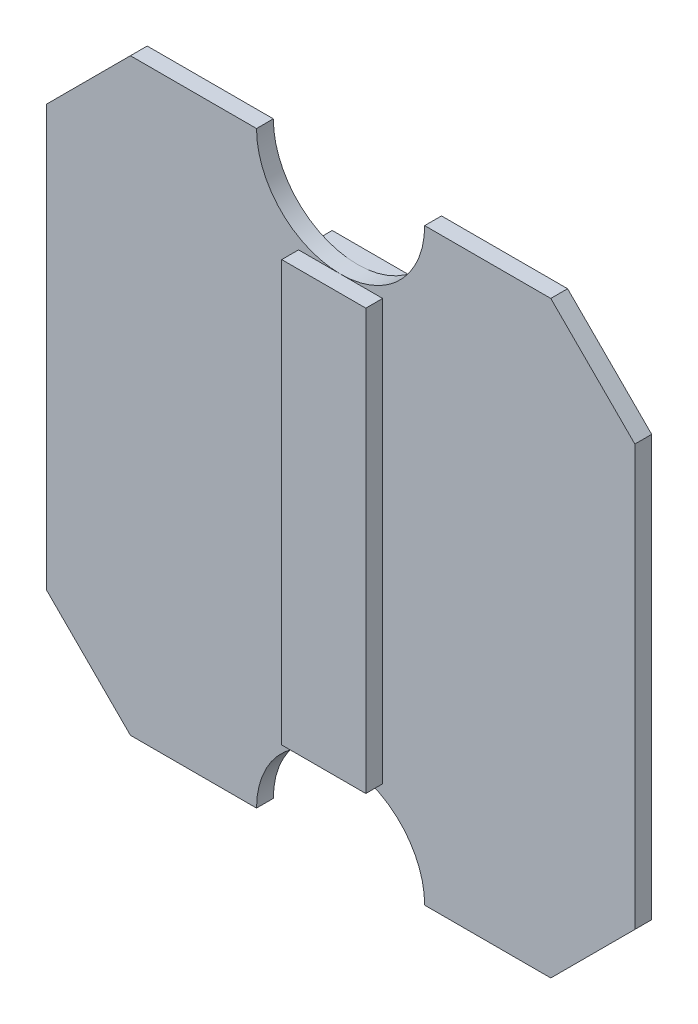
ISO-10303-21;
HEADER;
FILE_DESCRIPTION(('STEP AP214'),'2;1');
FILE_NAME('part.step','',(''),(''),'','','');
FILE_SCHEMA(('AUTOMOTIVE_DESIGN { 1 0 10303 214 1 1 1 1 }'));
ENDSEC;
DATA;
#1=APPLICATION_CONTEXT('core data for automotive mechanical design processes');
#2=APPLICATION_PROTOCOL_DEFINITION('international standard','automotive_design',2000,#1);
#3=PRODUCT_CONTEXT('',#1,'mechanical');
#4=PRODUCT('Part','Part','',(#3));
#5=PRODUCT_RELATED_PRODUCT_CATEGORY('part','',(#4));
#6=PRODUCT_DEFINITION_FORMATION('','',#4);
#7=PRODUCT_DEFINITION_CONTEXT('part definition',#1,'design');
#8=PRODUCT_DEFINITION('design','',#6,#7);
#9=PRODUCT_DEFINITION_SHAPE('','',#8);
#10=(LENGTH_UNIT() NAMED_UNIT(*) SI_UNIT(.MILLI.,.METRE.));
#11=(NAMED_UNIT(*) PLANE_ANGLE_UNIT() SI_UNIT($,.RADIAN.));
#12=(NAMED_UNIT(*) SI_UNIT($,.STERADIAN.) SOLID_ANGLE_UNIT());
#13=UNCERTAINTY_MEASURE_WITH_UNIT(LENGTH_MEASURE(1.E-05),#10,'distance_accuracy_value','');
#14=(GEOMETRIC_REPRESENTATION_CONTEXT(3) GLOBAL_UNCERTAINTY_ASSIGNED_CONTEXT((#13)) GLOBAL_UNIT_ASSIGNED_CONTEXT((#10,
#11,#12)) REPRESENTATION_CONTEXT('',''));
#15=CARTESIAN_POINT('',(0.,0.,0.));
#16=DIRECTION('',(0.,0.,1.));
#17=DIRECTION('',(1.,0.,0.));
#18=AXIS2_PLACEMENT_3D('',#15,#16,#17);
#19=CARTESIAN_POINT('',(0.,175.,10.));
#20=DIRECTION('',(0.,0.,1.));
#21=DIRECTION('',(1.,0.,0.));
#22=AXIS2_PLACEMENT_3D('',#19,#20,#21);
#23=PLANE('',#22);
#24=DIRECTION('',(1.,0.,0.));
#25=VECTOR('',#24,1.);
#26=CARTESIAN_POINT('',(0.,-125.,10.));
#27=LINE('',#26,#25);
#28=CARTESIAN_POINT('',(0.,-125.,10.));
#29=VERTEX_POINT('',#28);
#30=CARTESIAN_POINT('',(25.,-125.,10.));
#31=VERTEX_POINT('',#30);
#32=EDGE_CURVE('E236',#29,#31,#27,.T.);
#33=ORIENTED_EDGE('',*,*,#32,.F.);
#34=CARTESIAN_POINT('',(0.,-175.,10.));
#35=DIRECTION('',(0.,0.,-1.));
#36=DIRECTION('',(1.,0.,0.));
#37=AXIS2_PLACEMENT_3D('',#34,#35,#36);
#38=CIRCLE('',#37,50.);
#39=CARTESIAN_POINT('',(50.,-175.,10.));
#40=VERTEX_POINT('',#39);
#41=EDGE_CURVE('E255',#29,#40,#38,.T.);
#42=ORIENTED_EDGE('',*,*,#41,.T.);
#43=DIRECTION('',(1.,0.,0.));
#44=VECTOR('',#43,1.);
#45=CARTESIAN_POINT('',(50.,-175.,10.));
#46=LINE('',#45,#44);
#47=CARTESIAN_POINT('',(125.,-175.,10.));
#48=VERTEX_POINT('',#47);
#49=EDGE_CURVE('E259',#40,#48,#46,.T.);
#50=ORIENTED_EDGE('',*,*,#49,.T.);
#51=DIRECTION('',(0.707106781186547,0.707106781186548,0.));
#52=VECTOR('',#51,1.);
#53=CARTESIAN_POINT('',(125.,-175.,10.));
#54=LINE('',#53,#52);
#55=CARTESIAN_POINT('',(175.,-125.,10.));
#56=VERTEX_POINT('',#55);
#57=EDGE_CURVE('E261',#48,#56,#54,.T.);
#58=ORIENTED_EDGE('',*,*,#57,.T.);
#59=DIRECTION('',(0.,1.,0.));
#60=VECTOR('',#59,1.);
#61=CARTESIAN_POINT('',(175.,125.,10.));
#62=LINE('',#61,#60);
#63=CARTESIAN_POINT('',(175.,125.,10.));
#64=VERTEX_POINT('',#63);
#65=EDGE_CURVE('E263',#56,#64,#62,.T.);
#66=ORIENTED_EDGE('',*,*,#65,.T.);
#67=DIRECTION('',(-0.707106781186547,0.707106781186548,0.));
#68=VECTOR('',#67,1.);
#69=CARTESIAN_POINT('',(125.,175.,10.));
#70=LINE('',#69,#68);
#71=CARTESIAN_POINT('',(125.,175.,10.));
#72=VERTEX_POINT('',#71);
#73=EDGE_CURVE('E265',#64,#72,#70,.T.);
#74=ORIENTED_EDGE('',*,*,#73,.T.);
#75=DIRECTION('',(-1.,0.,0.));
#76=VECTOR('',#75,1.);
#77=CARTESIAN_POINT('',(50.,175.,10.));
#78=LINE('',#77,#76);
#79=CARTESIAN_POINT('',(50.,175.,10.));
#80=VERTEX_POINT('',#79);
#81=EDGE_CURVE('E267',#72,#80,#78,.T.);
#82=ORIENTED_EDGE('',*,*,#81,.T.);
#83=CARTESIAN_POINT('',(0.,175.,10.));
#84=DIRECTION('',(0.,0.,-1.));
#85=DIRECTION('',(1.,0.,0.));
#86=AXIS2_PLACEMENT_3D('',#83,#84,#85);
#87=CIRCLE('',#86,50.);
#88=CARTESIAN_POINT('',(0.,125.,10.));
#89=VERTEX_POINT('',#88);
#90=EDGE_CURVE('E241',#80,#89,#87,.T.);
#91=ORIENTED_EDGE('',*,*,#90,.T.);
#92=DIRECTION('',(1.,0.,0.));
#93=VECTOR('',#92,1.);
#94=CARTESIAN_POINT('',(0.,125.,10.));
#95=LINE('',#94,#93);
#96=CARTESIAN_POINT('',(25.,125.,10.));
#97=VERTEX_POINT('',#96);
#98=EDGE_CURVE('E221',#89,#97,#95,.T.);
#99=ORIENTED_EDGE('',*,*,#98,.T.);
#100=DIRECTION('',(0.,-1.,0.));
#101=VECTOR('',#100,1.);
#102=CARTESIAN_POINT('',(25.,175.,10.));
#103=LINE('',#102,#101);
#104=EDGE_CURVE('E187',#97,#31,#103,.T.);
#105=ORIENTED_EDGE('',*,*,#104,.T.);
#106=EDGE_LOOP('',(#33,#42,#50,#58,#66,#74,#82,#91,#99,#105));
#107=FACE_BOUND('',#106,.T.);
#108=ADVANCED_FACE('F34',(#107),#23,.T.);
#109=CARTESIAN_POINT('',(0.,175.,0.));
#110=DIRECTION('',(0.,0.,1.));
#111=DIRECTION('',(1.,0.,0.));
#112=AXIS2_PLACEMENT_3D('',#109,#110,#111);
#113=PLANE('',#112);
#114=CARTESIAN_POINT('',(0.,-175.,0.));
#115=DIRECTION('',(0.,0.,-1.));
#116=DIRECTION('',(1.,0.,0.));
#117=AXIS2_PLACEMENT_3D('',#114,#115,#116);
#118=CIRCLE('',#117,50.);
#119=CARTESIAN_POINT('',(0.,-125.,0.));
#120=VERTEX_POINT('',#119);
#121=CARTESIAN_POINT('',(50.,-175.,0.));
#122=VERTEX_POINT('',#121);
#123=EDGE_CURVE('E283',#120,#122,#118,.T.);
#124=ORIENTED_EDGE('',*,*,#123,.F.);
#125=DIRECTION('',(1.,0.,0.));
#126=VECTOR('',#125,1.);
#127=CARTESIAN_POINT('',(0.,-125.,0.));
#128=LINE('',#127,#126);
#129=CARTESIAN_POINT('',(25.,-125.,0.));
#130=VERTEX_POINT('',#129);
#131=EDGE_CURVE('E11',#120,#130,#128,.T.);
#132=ORIENTED_EDGE('',*,*,#131,.T.);
#133=DIRECTION('',(0.,-1.,0.));
#134=VECTOR('',#133,1.);
#135=CARTESIAN_POINT('',(25.,175.,0.));
#136=LINE('',#135,#134);
#137=CARTESIAN_POINT('',(25.,125.,0.));
#138=VERTEX_POINT('',#137);
#139=EDGE_CURVE('E38',#138,#130,#136,.T.);
#140=ORIENTED_EDGE('',*,*,#139,.F.);
#141=DIRECTION('',(1.,0.,0.));
#142=VECTOR('',#141,1.);
#143=CARTESIAN_POINT('',(0.,125.,0.));
#144=LINE('',#143,#142);
#145=CARTESIAN_POINT('',(0.,125.,0.));
#146=VERTEX_POINT('',#145);
#147=EDGE_CURVE('E332',#146,#138,#144,.T.);
#148=ORIENTED_EDGE('',*,*,#147,.F.);
#149=CARTESIAN_POINT('',(0.,175.,0.));
#150=DIRECTION('',(0.,0.,-1.));
#151=DIRECTION('',(1.,0.,0.));
#152=AXIS2_PLACEMENT_3D('',#149,#150,#151);
#153=CIRCLE('',#152,50.);
#154=CARTESIAN_POINT('',(50.,175.,0.));
#155=VERTEX_POINT('',#154);
#156=EDGE_CURVE('E270',#155,#146,#153,.T.);
#157=ORIENTED_EDGE('',*,*,#156,.F.);
#158=DIRECTION('',(-1.,0.,0.));
#159=VECTOR('',#158,1.);
#160=CARTESIAN_POINT('',(50.,175.,0.));
#161=LINE('',#160,#159);
#162=CARTESIAN_POINT('',(125.,175.,0.));
#163=VERTEX_POINT('',#162);
#164=EDGE_CURVE('E295',#163,#155,#161,.T.);
#165=ORIENTED_EDGE('',*,*,#164,.F.);
#166=DIRECTION('',(-0.707106781186547,0.707106781186548,0.));
#167=VECTOR('',#166,1.);
#168=CARTESIAN_POINT('',(125.,175.,0.));
#169=LINE('',#168,#167);
#170=CARTESIAN_POINT('',(175.,125.,0.));
#171=VERTEX_POINT('',#170);
#172=EDGE_CURVE('E293',#171,#163,#169,.T.);
#173=ORIENTED_EDGE('',*,*,#172,.F.);
#174=DIRECTION('',(0.,1.,0.));
#175=VECTOR('',#174,1.);
#176=CARTESIAN_POINT('',(175.,125.,0.));
#177=LINE('',#176,#175);
#178=CARTESIAN_POINT('',(175.,-125.,0.));
#179=VERTEX_POINT('',#178);
#180=EDGE_CURVE('E291',#179,#171,#177,.T.);
#181=ORIENTED_EDGE('',*,*,#180,.F.);
#182=DIRECTION('',(0.707106781186547,0.707106781186548,0.));
#183=VECTOR('',#182,1.);
#184=CARTESIAN_POINT('',(125.,-175.,0.));
#185=LINE('',#184,#183);
#186=CARTESIAN_POINT('',(125.,-175.,0.));
#187=VERTEX_POINT('',#186);
#188=EDGE_CURVE('E289',#187,#179,#185,.T.);
#189=ORIENTED_EDGE('',*,*,#188,.F.);
#190=DIRECTION('',(1.,0.,0.));
#191=VECTOR('',#190,1.);
#192=CARTESIAN_POINT('',(50.,-175.,0.));
#193=LINE('',#192,#191);
#194=EDGE_CURVE('E287',#122,#187,#193,.T.);
#195=ORIENTED_EDGE('',*,*,#194,.F.);
#196=EDGE_LOOP('',(#124,#132,#140,#148,#157,#165,#173,#181,#189,#195));
#197=FACE_BOUND('',#196,.T.);
#198=ADVANCED_FACE('F359',(#197),#113,.F.);
#199=CARTESIAN_POINT('',(0.,175.,10.));
#200=DIRECTION('',(0.,0.,-1.));
#201=DIRECTION('',(-1.,0.,0.));
#202=AXIS2_PLACEMENT_3D('',#199,#200,#201);
#203=CYLINDRICAL_SURFACE('',#202,50.);
#204=ORIENTED_EDGE('',*,*,#156,.T.);
#205=CARTESIAN_POINT('',(-50.,175.,0.));
#206=VERTEX_POINT('',#205);
#207=EDGE_CURVE('E240',#146,#206,#153,.T.);
#208=ORIENTED_EDGE('',*,*,#207,.T.);
#209=DIRECTION('',(0.,0.,-1.));
#210=VECTOR('',#209,1.);
#211=CARTESIAN_POINT('',(-50.,175.,10.));
#212=LINE('',#211,#210);
#213=CARTESIAN_POINT('',(-50.,175.,10.));
#214=VERTEX_POINT('',#213);
#215=EDGE_CURVE('E329',#214,#206,#212,.T.);
#216=ORIENTED_EDGE('',*,*,#215,.F.);
#217=EDGE_CURVE('E245',#89,#214,#87,.T.);
#218=ORIENTED_EDGE('',*,*,#217,.F.);
#219=ORIENTED_EDGE('',*,*,#90,.F.);
#220=DIRECTION('',(0.,0.,-1.));
#221=VECTOR('',#220,1.);
#222=CARTESIAN_POINT('',(50.,175.,10.));
#223=LINE('',#222,#221);
#224=EDGE_CURVE('E269',#80,#155,#223,.T.);
#225=ORIENTED_EDGE('',*,*,#224,.T.);
#226=EDGE_LOOP('',(#204,#208,#216,#218,#219,#225));
#227=FACE_BOUND('',#226,.T.);
#228=ADVANCED_FACE('F36',(#227),#203,.F.);
#229=CARTESIAN_POINT('',(-125.,175.,10.));
#230=DIRECTION('',(0.,-1.,0.));
#231=DIRECTION('',(0.,0.,-1.));
#232=AXIS2_PLACEMENT_3D('',#229,#230,#231);
#233=PLANE('',#232);
#234=DIRECTION('',(-1.,0.,0.));
#235=VECTOR('',#234,1.);
#236=CARTESIAN_POINT('',(-125.,175.,0.));
#237=LINE('',#236,#235);
#238=CARTESIAN_POINT('',(-125.,175.,0.));
#239=VERTEX_POINT('',#238);
#240=EDGE_CURVE('E273',#206,#239,#237,.T.);
#241=ORIENTED_EDGE('',*,*,#240,.T.);
#242=DIRECTION('',(0.,0.,-1.));
#243=VECTOR('',#242,1.);
#244=CARTESIAN_POINT('',(-125.,175.,10.));
#245=LINE('',#244,#243);
#246=CARTESIAN_POINT('',(-125.,175.,10.));
#247=VERTEX_POINT('',#246);
#248=EDGE_CURVE('E326',#247,#239,#245,.T.);
#249=ORIENTED_EDGE('',*,*,#248,.F.);
#250=DIRECTION('',(-1.,0.,0.));
#251=VECTOR('',#250,1.);
#252=CARTESIAN_POINT('',(-125.,175.,10.));
#253=LINE('',#252,#251);
#254=EDGE_CURVE('E244',#214,#247,#253,.T.);
#255=ORIENTED_EDGE('',*,*,#254,.F.);
#256=ORIENTED_EDGE('',*,*,#215,.T.);
#257=EDGE_LOOP('',(#241,#249,#255,#256));
#258=FACE_BOUND('',#257,.T.);
#259=ADVANCED_FACE('F419',(#258),#233,.F.);
#260=CARTESIAN_POINT('',(-125.,175.,10.));
#261=DIRECTION('',(0.707106781186548,-0.707106781186547,0.));
#262=DIRECTION('',(0.707106781186547,0.707106781186548,0.));
#263=AXIS2_PLACEMENT_3D('',#260,#261,#262);
#264=PLANE('',#263);
#265=DIRECTION('',(-0.707106781186547,-0.707106781186548,0.));
#266=VECTOR('',#265,1.);
#267=CARTESIAN_POINT('',(-125.,175.,0.));
#268=LINE('',#267,#266);
#269=CARTESIAN_POINT('',(-175.,125.,0.));
#270=VERTEX_POINT('',#269);
#271=EDGE_CURVE('E275',#239,#270,#268,.T.);
#272=ORIENTED_EDGE('',*,*,#271,.T.);
#273=DIRECTION('',(0.,0.,-1.));
#274=VECTOR('',#273,1.);
#275=CARTESIAN_POINT('',(-175.,125.,10.));
#276=LINE('',#275,#274);
#277=CARTESIAN_POINT('',(-175.,125.,10.));
#278=VERTEX_POINT('',#277);
#279=EDGE_CURVE('E323',#278,#270,#276,.T.);
#280=ORIENTED_EDGE('',*,*,#279,.F.);
#281=DIRECTION('',(-0.707106781186547,-0.707106781186548,0.));
#282=VECTOR('',#281,1.);
#283=CARTESIAN_POINT('',(-125.,175.,10.));
#284=LINE('',#283,#282);
#285=EDGE_CURVE('E247',#247,#278,#284,.T.);
#286=ORIENTED_EDGE('',*,*,#285,.F.);
#287=ORIENTED_EDGE('',*,*,#248,.T.);
#288=EDGE_LOOP('',(#272,#280,#286,#287));
#289=FACE_BOUND('',#288,.T.);
#290=ADVANCED_FACE('F414',(#289),#264,.F.);
#291=CARTESIAN_POINT('',(-175.,125.,10.));
#292=DIRECTION('',(1.,0.,0.));
#293=DIRECTION('',(0.,0.,-1.));
#294=AXIS2_PLACEMENT_3D('',#291,#292,#293);
#295=PLANE('',#294);
#296=DIRECTION('',(0.,-1.,0.));
#297=VECTOR('',#296,1.);
#298=CARTESIAN_POINT('',(-175.,125.,0.));
#299=LINE('',#298,#297);
#300=CARTESIAN_POINT('',(-175.,-125.,0.));
#301=VERTEX_POINT('',#300);
#302=EDGE_CURVE('E277',#270,#301,#299,.T.);
#303=ORIENTED_EDGE('',*,*,#302,.T.);
#304=DIRECTION('',(0.,0.,-1.));
#305=VECTOR('',#304,1.);
#306=CARTESIAN_POINT('',(-175.,-125.,10.));
#307=LINE('',#306,#305);
#308=CARTESIAN_POINT('',(-175.,-125.,10.));
#309=VERTEX_POINT('',#308);
#310=EDGE_CURVE('E320',#309,#301,#307,.T.);
#311=ORIENTED_EDGE('',*,*,#310,.F.);
#312=DIRECTION('',(0.,-1.,0.));
#313=VECTOR('',#312,1.);
#314=CARTESIAN_POINT('',(-175.,125.,10.));
#315=LINE('',#314,#313);
#316=EDGE_CURVE('E249',#278,#309,#315,.T.);
#317=ORIENTED_EDGE('',*,*,#316,.F.);
#318=ORIENTED_EDGE('',*,*,#279,.T.);
#319=EDGE_LOOP('',(#303,#311,#317,#318));
#320=FACE_BOUND('',#319,.T.);
#321=ADVANCED_FACE('F411',(#320),#295,.F.);
#322=CARTESIAN_POINT('',(-125.,-175.,10.));
#323=DIRECTION('',(0.707106781186548,0.707106781186547,0.));
#324=DIRECTION('',(-0.707106781186547,0.707106781186548,0.));
#325=AXIS2_PLACEMENT_3D('',#322,#323,#324);
#326=PLANE('',#325);
#327=DIRECTION('',(0.707106781186547,-0.707106781186548,0.));
#328=VECTOR('',#327,1.);
#329=CARTESIAN_POINT('',(-125.,-175.,0.));
#330=LINE('',#329,#328);
#331=CARTESIAN_POINT('',(-125.,-175.,0.));
#332=VERTEX_POINT('',#331);
#333=EDGE_CURVE('E279',#301,#332,#330,.T.);
#334=ORIENTED_EDGE('',*,*,#333,.T.);
#335=DIRECTION('',(0.,0.,-1.));
#336=VECTOR('',#335,1.);
#337=CARTESIAN_POINT('',(-125.,-175.,10.));
#338=LINE('',#337,#336);
#339=CARTESIAN_POINT('',(-125.,-175.,10.));
#340=VERTEX_POINT('',#339);
#341=EDGE_CURVE('E317',#340,#332,#338,.T.);
#342=ORIENTED_EDGE('',*,*,#341,.F.);
#343=DIRECTION('',(0.707106781186547,-0.707106781186548,0.));
#344=VECTOR('',#343,1.);
#345=CARTESIAN_POINT('',(-125.,-175.,10.));
#346=LINE('',#345,#344);
#347=EDGE_CURVE('E251',#309,#340,#346,.T.);
#348=ORIENTED_EDGE('',*,*,#347,.F.);
#349=ORIENTED_EDGE('',*,*,#310,.T.);
#350=EDGE_LOOP('',(#334,#342,#348,#349));
#351=FACE_BOUND('',#350,.T.);
#352=ADVANCED_FACE('F407',(#351),#326,.F.);
#353=CARTESIAN_POINT('',(-125.,-175.,10.));
#354=DIRECTION('',(0.,1.,0.));
#355=DIRECTION('',(0.,0.,1.));
#356=AXIS2_PLACEMENT_3D('',#353,#354,#355);
#357=PLANE('',#356);
#358=DIRECTION('',(1.,0.,0.));
#359=VECTOR('',#358,1.);
#360=CARTESIAN_POINT('',(-125.,-175.,0.));
#361=LINE('',#360,#359);
#362=CARTESIAN_POINT('',(-50.,-175.,0.));
#363=VERTEX_POINT('',#362);
#364=EDGE_CURVE('E281',#332,#363,#361,.T.);
#365=ORIENTED_EDGE('',*,*,#364,.T.);
#366=DIRECTION('',(0.,0.,-1.));
#367=VECTOR('',#366,1.);
#368=CARTESIAN_POINT('',(-50.,-175.,10.));
#369=LINE('',#368,#367);
#370=CARTESIAN_POINT('',(-50.,-175.,10.));
#371=VERTEX_POINT('',#370);
#372=EDGE_CURVE('E314',#371,#363,#369,.T.);
#373=ORIENTED_EDGE('',*,*,#372,.F.);
#374=DIRECTION('',(1.,0.,0.));
#375=VECTOR('',#374,1.);
#376=CARTESIAN_POINT('',(-125.,-175.,10.));
#377=LINE('',#376,#375);
#378=EDGE_CURVE('E253',#340,#371,#377,.T.);
#379=ORIENTED_EDGE('',*,*,#378,.F.);
#380=ORIENTED_EDGE('',*,*,#341,.T.);
#381=EDGE_LOOP('',(#365,#373,#379,#380));
#382=FACE_BOUND('',#381,.T.);
#383=ADVANCED_FACE('F402',(#382),#357,.F.);
#384=CARTESIAN_POINT('',(0.,-175.,10.));
#385=DIRECTION('',(0.,0.,-1.));
#386=DIRECTION('',(-1.,0.,0.));
#387=AXIS2_PLACEMENT_3D('',#384,#385,#386);
#388=CYLINDRICAL_SURFACE('',#387,50.);
#389=EDGE_CURVE('E284',#363,#120,#118,.T.);
#390=ORIENTED_EDGE('',*,*,#389,.T.);
#391=ORIENTED_EDGE('',*,*,#123,.T.);
#392=DIRECTION('',(0.,0.,-1.));
#393=VECTOR('',#392,1.);
#394=CARTESIAN_POINT('',(50.,-175.,10.));
#395=LINE('',#394,#393);
#396=EDGE_CURVE('E311',#40,#122,#395,.T.);
#397=ORIENTED_EDGE('',*,*,#396,.F.);
#398=ORIENTED_EDGE('',*,*,#41,.F.);
#399=EDGE_CURVE('E256',#371,#29,#38,.T.);
#400=ORIENTED_EDGE('',*,*,#399,.F.);
#401=ORIENTED_EDGE('',*,*,#372,.T.);
#402=EDGE_LOOP('',(#390,#391,#397,#398,#400,#401));
#403=FACE_BOUND('',#402,.T.);
#404=ADVANCED_FACE('F395',(#403),#388,.F.);
#405=CARTESIAN_POINT('',(50.,-175.,10.));
#406=DIRECTION('',(0.,1.,0.));
#407=DIRECTION('',(0.,0.,1.));
#408=AXIS2_PLACEMENT_3D('',#405,#406,#407);
#409=PLANE('',#408);
#410=ORIENTED_EDGE('',*,*,#194,.T.);
#411=DIRECTION('',(0.,0.,-1.));
#412=VECTOR('',#411,1.);
#413=CARTESIAN_POINT('',(125.,-175.,10.));
#414=LINE('',#413,#412);
#415=EDGE_CURVE('E308',#48,#187,#414,.T.);
#416=ORIENTED_EDGE('',*,*,#415,.F.);
#417=ORIENTED_EDGE('',*,*,#49,.F.);
#418=ORIENTED_EDGE('',*,*,#396,.T.);
#419=EDGE_LOOP('',(#410,#416,#417,#418));
#420=FACE_BOUND('',#419,.T.);
#421=ADVANCED_FACE('F390',(#420),#409,.F.);
#422=CARTESIAN_POINT('',(125.,-175.,10.));
#423=DIRECTION('',(-0.707106781186548,0.707106781186547,0.));
#424=DIRECTION('',(-0.707106781186547,-0.707106781186548,0.));
#425=AXIS2_PLACEMENT_3D('',#422,#423,#424);
#426=PLANE('',#425);
#427=ORIENTED_EDGE('',*,*,#188,.T.);
#428=DIRECTION('',(0.,0.,-1.));
#429=VECTOR('',#428,1.);
#430=CARTESIAN_POINT('',(175.,-125.,10.));
#431=LINE('',#430,#429);
#432=EDGE_CURVE('E305',#56,#179,#431,.T.);
#433=ORIENTED_EDGE('',*,*,#432,.F.);
#434=ORIENTED_EDGE('',*,*,#57,.F.);
#435=ORIENTED_EDGE('',*,*,#415,.T.);
#436=EDGE_LOOP('',(#427,#433,#434,#435));
#437=FACE_BOUND('',#436,.T.);
#438=ADVANCED_FACE('F386',(#437),#426,.F.);
#439=CARTESIAN_POINT('',(175.,125.,10.));
#440=DIRECTION('',(-1.,0.,0.));
#441=DIRECTION('',(0.,0.,1.));
#442=AXIS2_PLACEMENT_3D('',#439,#440,#441);
#443=PLANE('',#442);
#444=ORIENTED_EDGE('',*,*,#180,.T.);
#445=DIRECTION('',(0.,0.,-1.));
#446=VECTOR('',#445,1.);
#447=CARTESIAN_POINT('',(175.,125.,10.));
#448=LINE('',#447,#446);
#449=EDGE_CURVE('E302',#64,#171,#448,.T.);
#450=ORIENTED_EDGE('',*,*,#449,.F.);
#451=ORIENTED_EDGE('',*,*,#65,.F.);
#452=ORIENTED_EDGE('',*,*,#432,.T.);
#453=EDGE_LOOP('',(#444,#450,#451,#452));
#454=FACE_BOUND('',#453,.T.);
#455=ADVANCED_FACE('F382',(#454),#443,.F.);
#456=CARTESIAN_POINT('',(125.,175.,10.));
#457=DIRECTION('',(-0.707106781186548,-0.707106781186547,0.));
#458=DIRECTION('',(0.707106781186547,-0.707106781186548,0.));
#459=AXIS2_PLACEMENT_3D('',#456,#457,#458);
#460=PLANE('',#459);
#461=ORIENTED_EDGE('',*,*,#172,.T.);
#462=DIRECTION('',(0.,0.,-1.));
#463=VECTOR('',#462,1.);
#464=CARTESIAN_POINT('',(125.,175.,10.));
#465=LINE('',#464,#463);
#466=EDGE_CURVE('E299',#72,#163,#465,.T.);
#467=ORIENTED_EDGE('',*,*,#466,.F.);
#468=ORIENTED_EDGE('',*,*,#73,.F.);
#469=ORIENTED_EDGE('',*,*,#449,.T.);
#470=EDGE_LOOP('',(#461,#467,#468,#469));
#471=FACE_BOUND('',#470,.T.);
#472=ADVANCED_FACE('F377',(#471),#460,.F.);
#473=CARTESIAN_POINT('',(50.,175.,10.));
#474=DIRECTION('',(0.,-1.,0.));
#475=DIRECTION('',(0.,0.,-1.));
#476=AXIS2_PLACEMENT_3D('',#473,#474,#475);
#477=PLANE('',#476);
#478=ORIENTED_EDGE('',*,*,#164,.T.);
#479=ORIENTED_EDGE('',*,*,#224,.F.);
#480=ORIENTED_EDGE('',*,*,#81,.F.);
#481=ORIENTED_EDGE('',*,*,#466,.T.);
#482=EDGE_LOOP('',(#478,#479,#480,#481));
#483=FACE_BOUND('',#482,.T.);
#484=ADVANCED_FACE('F371',(#483),#477,.F.);
#485=CARTESIAN_POINT('',(-25.,-125.,10.));
#486=VERTEX_POINT('',#485);
#487=EDGE_CURVE('E238',#486,#29,#27,.T.);
#488=ORIENTED_EDGE('',*,*,#487,.F.);
#489=DIRECTION('',(0.,1.,0.));
#490=VECTOR('',#489,1.);
#491=CARTESIAN_POINT('',(-25.,175.,10.));
#492=LINE('',#491,#490);
#493=CARTESIAN_POINT('',(-25.,125.,10.));
#494=VERTEX_POINT('',#493);
#495=EDGE_CURVE('E233',#486,#494,#492,.T.);
#496=ORIENTED_EDGE('',*,*,#495,.T.);
#497=EDGE_CURVE('E232',#494,#89,#95,.T.);
#498=ORIENTED_EDGE('',*,*,#497,.T.);
#499=ORIENTED_EDGE('',*,*,#217,.T.);
#500=ORIENTED_EDGE('',*,*,#254,.T.);
#501=ORIENTED_EDGE('',*,*,#285,.T.);
#502=ORIENTED_EDGE('',*,*,#316,.T.);
#503=ORIENTED_EDGE('',*,*,#347,.T.);
#504=ORIENTED_EDGE('',*,*,#378,.T.);
#505=ORIENTED_EDGE('',*,*,#399,.T.);
#506=EDGE_LOOP('',(#488,#496,#498,#499,#500,#501,#502,#503,#504,#505));
#507=FACE_BOUND('',#506,.T.);
#508=ADVANCED_FACE('F428',(#507),#23,.T.);
#509=DIRECTION('',(0.,1.,0.));
#510=VECTOR('',#509,1.);
#511=CARTESIAN_POINT('',(-25.,175.,0.));
#512=LINE('',#511,#510);
#513=CARTESIAN_POINT('',(-25.,-125.,0.));
#514=VERTEX_POINT('',#513);
#515=CARTESIAN_POINT('',(-25.,125.,0.));
#516=VERTEX_POINT('',#515);
#517=EDGE_CURVE('E336',#514,#516,#512,.T.);
#518=ORIENTED_EDGE('',*,*,#517,.F.);
#519=EDGE_CURVE('E43',#514,#120,#128,.T.);
#520=ORIENTED_EDGE('',*,*,#519,.T.);
#521=ORIENTED_EDGE('',*,*,#389,.F.);
#522=ORIENTED_EDGE('',*,*,#364,.F.);
#523=ORIENTED_EDGE('',*,*,#333,.F.);
#524=ORIENTED_EDGE('',*,*,#302,.F.);
#525=ORIENTED_EDGE('',*,*,#271,.F.);
#526=ORIENTED_EDGE('',*,*,#240,.F.);
#527=ORIENTED_EDGE('',*,*,#207,.F.);
#528=EDGE_CURVE('E335',#516,#146,#144,.T.);
#529=ORIENTED_EDGE('',*,*,#528,.F.);
#530=EDGE_LOOP('',(#518,#520,#521,#522,#523,#524,#525,#526,#527,#529));
#531=FACE_BOUND('',#530,.T.);
#532=ADVANCED_FACE('F362',(#531),#113,.F.);
#533=CARTESIAN_POINT('',(0.,0.,-10.));
#534=DIRECTION('',(0.,0.,1.));
#535=DIRECTION('',(1.,0.,0.));
#536=AXIS2_PLACEMENT_3D('',#533,#534,#535);
#537=PLANE('',#536);
#538=DIRECTION('',(0.,-1.,0.));
#539=VECTOR('',#538,1.);
#540=CARTESIAN_POINT('',(25.,0.,-10.));
#541=LINE('',#540,#539);
#542=CARTESIAN_POINT('',(25.,125.,-10.));
#543=VERTEX_POINT('',#542);
#544=CARTESIAN_POINT('',(25.,-125.,-10.));
#545=VERTEX_POINT('',#544);
#546=EDGE_CURVE('E210',#543,#545,#541,.T.);
#547=ORIENTED_EDGE('',*,*,#546,.T.);
#548=DIRECTION('',(1.,0.,0.));
#549=VECTOR('',#548,1.);
#550=CARTESIAN_POINT('',(0.,-125.,-10.));
#551=LINE('',#550,#549);
#552=CARTESIAN_POINT('',(-25.,-125.,-10.));
#553=VERTEX_POINT('',#552);
#554=EDGE_CURVE('E190',#553,#545,#551,.T.);
#555=ORIENTED_EDGE('',*,*,#554,.F.);
#556=DIRECTION('',(0.,1.,0.));
#557=VECTOR('',#556,1.);
#558=CARTESIAN_POINT('',(-25.,0.,-10.));
#559=LINE('',#558,#557);
#560=CARTESIAN_POINT('',(-25.,125.,-10.));
#561=VERTEX_POINT('',#560);
#562=EDGE_CURVE('E214',#553,#561,#559,.T.);
#563=ORIENTED_EDGE('',*,*,#562,.T.);
#564=DIRECTION('',(1.,0.,0.));
#565=VECTOR('',#564,1.);
#566=CARTESIAN_POINT('',(0.,125.,-10.));
#567=LINE('',#566,#565);
#568=EDGE_CURVE('E212',#561,#543,#567,.T.);
#569=ORIENTED_EDGE('',*,*,#568,.T.);
#570=EDGE_LOOP('',(#547,#555,#563,#569));
#571=FACE_BOUND('',#570,.T.);
#572=ADVANCED_FACE('F351',(#571),#537,.F.);
#573=CARTESIAN_POINT('',(0.,125.,-10.));
#574=DIRECTION('',(0.,-1.,0.));
#575=DIRECTION('',(0.,0.,-1.));
#576=AXIS2_PLACEMENT_3D('',#573,#574,#575);
#577=PLANE('',#576);
#578=DIRECTION('',(0.,0.,1.));
#579=VECTOR('',#578,1.);
#580=CARTESIAN_POINT('',(-25.,125.,-10.));
#581=LINE('',#580,#579);
#582=EDGE_CURVE('E227',#561,#516,#581,.T.);
#583=ORIENTED_EDGE('',*,*,#582,.T.);
#584=ORIENTED_EDGE('',*,*,#528,.T.);
#585=ORIENTED_EDGE('',*,*,#147,.T.);
#586=DIRECTION('',(0.,0.,1.));
#587=VECTOR('',#586,1.);
#588=CARTESIAN_POINT('',(25.,125.,-10.));
#589=LINE('',#588,#587);
#590=EDGE_CURVE('E189',#543,#138,#589,.T.);
#591=ORIENTED_EDGE('',*,*,#590,.F.);
#592=ORIENTED_EDGE('',*,*,#568,.F.);
#593=EDGE_LOOP('',(#583,#584,#585,#591,#592));
#594=FACE_BOUND('',#593,.T.);
#595=ADVANCED_FACE('F355',(#594),#577,.F.);
#596=CARTESIAN_POINT('',(-25.,0.,-10.));
#597=DIRECTION('',(1.,0.,0.));
#598=DIRECTION('',(0.,0.,-1.));
#599=AXIS2_PLACEMENT_3D('',#596,#597,#598);
#600=PLANE('',#599);
#601=DIRECTION('',(0.,0.,1.));
#602=VECTOR('',#601,1.);
#603=CARTESIAN_POINT('',(-25.,-125.,-10.));
#604=LINE('',#603,#602);
#605=EDGE_CURVE('E223',#553,#514,#604,.T.);
#606=ORIENTED_EDGE('',*,*,#605,.T.);
#607=ORIENTED_EDGE('',*,*,#517,.T.);
#608=ORIENTED_EDGE('',*,*,#582,.F.);
#609=ORIENTED_EDGE('',*,*,#562,.F.);
#610=EDGE_LOOP('',(#606,#607,#608,#609));
#611=FACE_BOUND('',#610,.T.);
#612=ADVANCED_FACE('F433',(#611),#600,.F.);
#613=CARTESIAN_POINT('',(0.,-125.,-10.));
#614=DIRECTION('',(0.,-1.,0.));
#615=DIRECTION('',(0.,0.,-1.));
#616=AXIS2_PLACEMENT_3D('',#613,#614,#615);
#617=PLANE('',#616);
#618=ORIENTED_EDGE('',*,*,#519,.F.);
#619=ORIENTED_EDGE('',*,*,#605,.F.);
#620=ORIENTED_EDGE('',*,*,#554,.T.);
#621=DIRECTION('',(0.,0.,1.));
#622=VECTOR('',#621,1.);
#623=CARTESIAN_POINT('',(25.,-125.,-10.));
#624=LINE('',#623,#622);
#625=EDGE_CURVE('E218',#545,#130,#624,.T.);
#626=ORIENTED_EDGE('',*,*,#625,.T.);
#627=ORIENTED_EDGE('',*,*,#131,.F.);
#628=EDGE_LOOP('',(#618,#619,#620,#626,#627));
#629=FACE_BOUND('',#628,.T.);
#630=ADVANCED_FACE('F347',(#629),#617,.T.);
#631=CARTESIAN_POINT('',(25.,0.,-10.));
#632=DIRECTION('',(-1.,0.,0.));
#633=DIRECTION('',(0.,-1.,0.));
#634=AXIS2_PLACEMENT_3D('',#631,#632,#633);
#635=PLANE('',#634);
#636=ORIENTED_EDGE('',*,*,#590,.T.);
#637=ORIENTED_EDGE('',*,*,#139,.T.);
#638=ORIENTED_EDGE('',*,*,#625,.F.);
#639=ORIENTED_EDGE('',*,*,#546,.F.);
#640=EDGE_LOOP('',(#636,#637,#638,#639));
#641=FACE_BOUND('',#640,.T.);
#642=ADVANCED_FACE('F343',(#641),#635,.F.);
#643=ORIENTED_EDGE('',*,*,#104,.F.);
#644=CARTESIAN_POINT('',(25.,125.,20.));
#645=VERTEX_POINT('',#644);
#646=EDGE_CURVE('E50',#97,#645,#589,.T.);
#647=ORIENTED_EDGE('',*,*,#646,.T.);
#648=DIRECTION('',(0.,-1.,0.));
#649=VECTOR('',#648,1.);
#650=CARTESIAN_POINT('',(25.,0.,20.));
#651=LINE('',#650,#649);
#652=CARTESIAN_POINT('',(25.,-125.,20.));
#653=VERTEX_POINT('',#652);
#654=EDGE_CURVE('E185',#645,#653,#651,.T.);
#655=ORIENTED_EDGE('',*,*,#654,.T.);
#656=EDGE_CURVE('E222',#31,#653,#624,.T.);
#657=ORIENTED_EDGE('',*,*,#656,.F.);
#658=EDGE_LOOP('',(#643,#647,#655,#657));
#659=FACE_BOUND('',#658,.T.);
#660=ADVANCED_FACE('F183',(#659),#635,.F.);
#661=CARTESIAN_POINT('',(-25.,-125.,20.));
#662=VERTEX_POINT('',#661);
#663=EDGE_CURVE('E226',#486,#662,#604,.T.);
#664=ORIENTED_EDGE('',*,*,#663,.F.);
#665=ORIENTED_EDGE('',*,*,#487,.T.);
#666=ORIENTED_EDGE('',*,*,#32,.T.);
#667=ORIENTED_EDGE('',*,*,#656,.T.);
#668=DIRECTION('',(1.,0.,0.));
#669=VECTOR('',#668,1.);
#670=CARTESIAN_POINT('',(0.,-125.,20.));
#671=LINE('',#670,#669);
#672=EDGE_CURVE('E200',#662,#653,#671,.T.);
#673=ORIENTED_EDGE('',*,*,#672,.F.);
#674=EDGE_LOOP('',(#664,#665,#666,#667,#673));
#675=FACE_BOUND('',#674,.T.);
#676=ADVANCED_FACE('F426',(#675),#617,.T.);
#677=ORIENTED_EDGE('',*,*,#495,.F.);
#678=ORIENTED_EDGE('',*,*,#663,.T.);
#679=DIRECTION('',(0.,1.,0.));
#680=VECTOR('',#679,1.);
#681=CARTESIAN_POINT('',(-25.,0.,20.));
#682=LINE('',#681,#680);
#683=CARTESIAN_POINT('',(-25.,125.,20.));
#684=VERTEX_POINT('',#683);
#685=EDGE_CURVE('E205',#662,#684,#682,.T.);
#686=ORIENTED_EDGE('',*,*,#685,.T.);
#687=EDGE_CURVE('E204',#494,#684,#581,.T.);
#688=ORIENTED_EDGE('',*,*,#687,.F.);
#689=EDGE_LOOP('',(#677,#678,#686,#688));
#690=FACE_BOUND('',#689,.T.);
#691=ADVANCED_FACE('F430',(#690),#600,.F.);
#692=ORIENTED_EDGE('',*,*,#497,.F.);
#693=ORIENTED_EDGE('',*,*,#687,.T.);
#694=DIRECTION('',(1.,0.,0.));
#695=VECTOR('',#694,1.);
#696=CARTESIAN_POINT('',(0.,125.,20.));
#697=LINE('',#696,#695);
#698=EDGE_CURVE('E197',#684,#645,#697,.T.);
#699=ORIENTED_EDGE('',*,*,#698,.T.);
#700=ORIENTED_EDGE('',*,*,#646,.F.);
#701=ORIENTED_EDGE('',*,*,#98,.F.);
#702=EDGE_LOOP('',(#692,#693,#699,#700,#701));
#703=FACE_BOUND('',#702,.T.);
#704=ADVANCED_FACE('F202',(#703),#577,.F.);
#705=CARTESIAN_POINT('',(0.,0.,20.));
#706=DIRECTION('',(0.,0.,1.));
#707=DIRECTION('',(1.,0.,0.));
#708=AXIS2_PLACEMENT_3D('',#705,#706,#707);
#709=PLANE('',#708);
#710=ORIENTED_EDGE('',*,*,#654,.F.);
#711=ORIENTED_EDGE('',*,*,#698,.F.);
#712=ORIENTED_EDGE('',*,*,#685,.F.);
#713=ORIENTED_EDGE('',*,*,#672,.T.);
#714=EDGE_LOOP('',(#710,#711,#712,#713));
#715=FACE_BOUND('',#714,.T.);
#716=ADVANCED_FACE('F195',(#715),#709,.T.);
#717=CLOSED_SHELL('',(#108,#198,#228,#259,#290,#321,#352,#383,#404,#421,#438,#455,#472,#484,
#508,#532,#572,#595,#612,#630,#642,#660,#676,#691,#704,#716));
#718=MANIFOLD_SOLID_BREP('B2',#717);
#719=ADVANCED_BREP_SHAPE_REPRESENTATION('',(#18,#718),#14);
#720=SHAPE_DEFINITION_REPRESENTATION(#9,#719);
ENDSEC;
END-ISO-10303-21;
